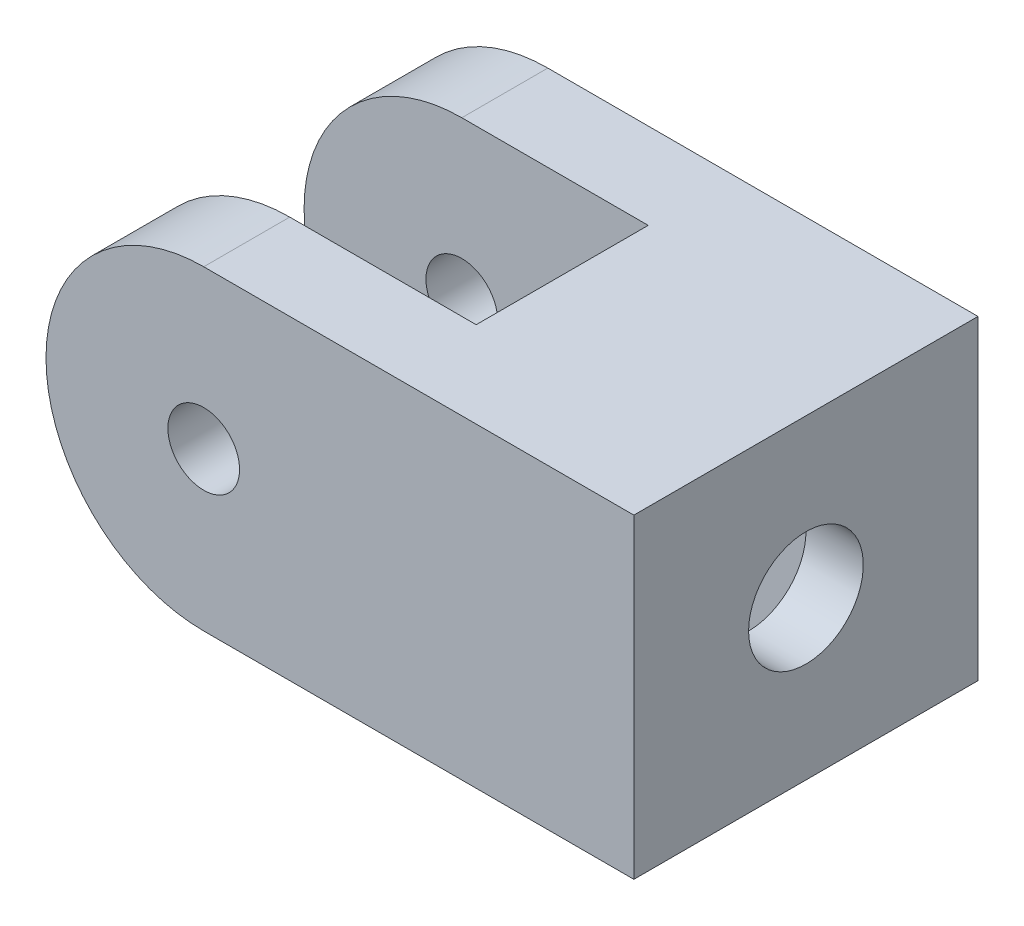
ISO-10303-21;
HEADER;
FILE_DESCRIPTION(('STEP AP214'),'2;1');
FILE_NAME('part.step','',(''),(''),'','','');
FILE_SCHEMA(('AUTOMOTIVE_DESIGN { 1 0 10303 214 1 1 1 1 }'));
ENDSEC;
DATA;
#1=APPLICATION_CONTEXT('core data for automotive mechanical design processes');
#2=APPLICATION_PROTOCOL_DEFINITION('international standard','automotive_design',2000,#1);
#3=PRODUCT_CONTEXT('',#1,'mechanical');
#4=PRODUCT('Part','Part','',(#3));
#5=PRODUCT_RELATED_PRODUCT_CATEGORY('part','',(#4));
#6=PRODUCT_DEFINITION_FORMATION('','',#4);
#7=PRODUCT_DEFINITION_CONTEXT('part definition',#1,'design');
#8=PRODUCT_DEFINITION('design','',#6,#7);
#9=PRODUCT_DEFINITION_SHAPE('','',#8);
#10=(LENGTH_UNIT() NAMED_UNIT(*) SI_UNIT(.MILLI.,.METRE.));
#11=(NAMED_UNIT(*) PLANE_ANGLE_UNIT() SI_UNIT($,.RADIAN.));
#12=(NAMED_UNIT(*) SI_UNIT($,.STERADIAN.) SOLID_ANGLE_UNIT());
#13=UNCERTAINTY_MEASURE_WITH_UNIT(LENGTH_MEASURE(1.E-05),#10,'distance_accuracy_value','');
#14=(GEOMETRIC_REPRESENTATION_CONTEXT(3) GLOBAL_UNCERTAINTY_ASSIGNED_CONTEXT((#13)) GLOBAL_UNIT_ASSIGNED_CONTEXT((#10,
#11,#12)) REPRESENTATION_CONTEXT('',''));
#15=CARTESIAN_POINT('',(0.,0.,0.));
#16=DIRECTION('',(0.,0.,1.));
#17=DIRECTION('',(1.,0.,0.));
#18=AXIS2_PLACEMENT_3D('',#15,#16,#17);
#19=CARTESIAN_POINT('',(13.,-11.,-5.99999999999999));
#20=DIRECTION('',(1.,0.,0.));
#21=DIRECTION('',(0.,0.,-1.));
#22=AXIS2_PLACEMENT_3D('',#19,#20,#21);
#23=PLANE('',#22);
#24=DIRECTION('',(0.,0.,-1.));
#25=VECTOR('',#24,1.);
#26=CARTESIAN_POINT('',(13.,11.,-5.99999999999999));
#27=LINE('',#26,#25);
#28=CARTESIAN_POINT('',(13.,11.,-5.99999999999999));
#29=VERTEX_POINT('',#28);
#30=CARTESIAN_POINT('',(13.,11.,-18.));
#31=VERTEX_POINT('',#30);
#32=EDGE_CURVE('E186',#29,#31,#27,.T.);
#33=ORIENTED_EDGE('',*,*,#32,.T.);
#34=DIRECTION('',(0.,1.,0.));
#35=VECTOR('',#34,1.);
#36=CARTESIAN_POINT('',(13.,-11.,-18.));
#37=LINE('',#36,#35);
#38=CARTESIAN_POINT('',(13.,-11.,-18.));
#39=VERTEX_POINT('',#38);
#40=EDGE_CURVE('E196',#39,#31,#37,.T.);
#41=ORIENTED_EDGE('',*,*,#40,.F.);
#42=DIRECTION('',(0.,0.,-1.));
#43=VECTOR('',#42,1.);
#44=CARTESIAN_POINT('',(13.,-11.,-5.99999999999999));
#45=LINE('',#44,#43);
#46=CARTESIAN_POINT('',(13.,-11.,-5.99999999999999));
#47=VERTEX_POINT('',#46);
#48=EDGE_CURVE('E189',#47,#39,#45,.T.);
#49=ORIENTED_EDGE('',*,*,#48,.F.);
#50=DIRECTION('',(0.,1.,0.));
#51=VECTOR('',#50,1.);
#52=CARTESIAN_POINT('',(13.,-11.,-5.99999999999999));
#53=LINE('',#52,#51);
#54=EDGE_CURVE('E192',#47,#29,#53,.T.);
#55=ORIENTED_EDGE('',*,*,#54,.T.);
#56=EDGE_LOOP('',(#33,#41,#49,#55));
#57=FACE_BOUND('',#56,.T.);
#58=CARTESIAN_POINT('',(13.,0.,-12.));
#59=DIRECTION('',(-1.,0.,0.));
#60=DIRECTION('',(0.,0.,1.));
#61=AXIS2_PLACEMENT_3D('',#58,#59,#60);
#62=CIRCLE('',#61,4.);
#63=CARTESIAN_POINT('',(13.,0.,-8.));
#64=VERTEX_POINT('',#63);
#65=EDGE_CURVE('E317',#64,#64,#62,.T.);
#66=ORIENTED_EDGE('',*,*,#65,.F.);
#67=EDGE_LOOP('',(#66));
#68=FACE_BOUND('',#67,.T.);
#69=ADVANCED_FACE('F36',(#57,#68),#23,.F.);
#70=CARTESIAN_POINT('',(30.,-11.,0.));
#71=DIRECTION('',(0.,-1.,0.));
#72=DIRECTION('',(0.,0.,-1.));
#73=AXIS2_PLACEMENT_3D('',#70,#71,#72);
#74=PLANE('',#73);
#75=DIRECTION('',(-1.,0.,0.));
#76=VECTOR('',#75,1.);
#77=CARTESIAN_POINT('',(13.,-11.,-18.));
#78=LINE('',#77,#76);
#79=CARTESIAN_POINT('',(0.,-11.,-18.));
#80=VERTEX_POINT('',#79);
#81=EDGE_CURVE('E182',#39,#80,#78,.T.);
#82=ORIENTED_EDGE('',*,*,#81,.T.);
#83=DIRECTION('',(0.,0.,-1.));
#84=VECTOR('',#83,1.);
#85=CARTESIAN_POINT('',(0.,-11.,0.));
#86=LINE('',#85,#84);
#87=CARTESIAN_POINT('',(0.,-11.,-24.));
#88=VERTEX_POINT('',#87);
#89=EDGE_CURVE('E230',#80,#88,#86,.T.);
#90=ORIENTED_EDGE('',*,*,#89,.T.);
#91=DIRECTION('',(-1.,0.,0.));
#92=VECTOR('',#91,1.);
#93=CARTESIAN_POINT('',(30.,-11.,-24.));
#94=LINE('',#93,#92);
#95=CARTESIAN_POINT('',(30.,-11.,-24.));
#96=VERTEX_POINT('',#95);
#97=EDGE_CURVE('E208',#96,#88,#94,.T.);
#98=ORIENTED_EDGE('',*,*,#97,.F.);
#99=DIRECTION('',(0.,0.,-1.));
#100=VECTOR('',#99,1.);
#101=CARTESIAN_POINT('',(30.,-11.,0.));
#102=LINE('',#101,#100);
#103=CARTESIAN_POINT('',(30.,-11.,0.));
#104=VERTEX_POINT('',#103);
#105=EDGE_CURVE('E231',#104,#96,#102,.T.);
#106=ORIENTED_EDGE('',*,*,#105,.F.);
#107=DIRECTION('',(-1.,0.,0.));
#108=VECTOR('',#107,1.);
#109=CARTESIAN_POINT('',(30.,-11.,0.));
#110=LINE('',#109,#108);
#111=CARTESIAN_POINT('',(0.,-11.,0.));
#112=VERTEX_POINT('',#111);
#113=EDGE_CURVE('E214',#104,#112,#110,.T.);
#114=ORIENTED_EDGE('',*,*,#113,.T.);
#115=CARTESIAN_POINT('',(0.,-11.,-5.99999999999999));
#116=VERTEX_POINT('',#115);
#117=EDGE_CURVE('E44',#112,#116,#86,.T.);
#118=ORIENTED_EDGE('',*,*,#117,.T.);
#119=DIRECTION('',(1.,0.,0.));
#120=VECTOR('',#119,1.);
#121=CARTESIAN_POINT('',(-17.11080660068,-11.,-5.99999999999999));
#122=LINE('',#121,#120);
#123=EDGE_CURVE('E185',#116,#47,#122,.T.);
#124=ORIENTED_EDGE('',*,*,#123,.T.);
#125=ORIENTED_EDGE('',*,*,#48,.T.);
#126=EDGE_LOOP('',(#82,#90,#98,#106,#114,#118,#124,#125));
#127=FACE_BOUND('',#126,.T.);
#128=DIRECTION('',(-1.,0.,0.));
#129=VECTOR('',#128,1.);
#130=CARTESIAN_POINT('',(26.,-11.,-5.5));
#131=LINE('',#130,#129);
#132=CARTESIAN_POINT('',(26.,-11.,-5.5));
#133=VERTEX_POINT('',#132);
#134=CARTESIAN_POINT('',(19.2,-11.,-5.5));
#135=VERTEX_POINT('',#134);
#136=EDGE_CURVE('E142',#133,#135,#131,.T.);
#137=ORIENTED_EDGE('',*,*,#136,.F.);
#138=DIRECTION('',(0.,0.,1.));
#139=VECTOR('',#138,1.);
#140=CARTESIAN_POINT('',(26.,-11.,-18.5));
#141=LINE('',#140,#139);
#142=CARTESIAN_POINT('',(26.,-11.,-18.5));
#143=VERTEX_POINT('',#142);
#144=EDGE_CURVE('E149',#143,#133,#141,.T.);
#145=ORIENTED_EDGE('',*,*,#144,.F.);
#146=DIRECTION('',(-1.,0.,0.));
#147=VECTOR('',#146,1.);
#148=CARTESIAN_POINT('',(26.,-11.,-18.5));
#149=LINE('',#148,#147);
#150=CARTESIAN_POINT('',(19.2,-11.,-18.5));
#151=VERTEX_POINT('',#150);
#152=EDGE_CURVE('E132',#143,#151,#149,.T.);
#153=ORIENTED_EDGE('',*,*,#152,.T.);
#154=DIRECTION('',(0.,0.,1.));
#155=VECTOR('',#154,1.);
#156=CARTESIAN_POINT('',(19.2,-11.,-18.5));
#157=LINE('',#156,#155);
#158=EDGE_CURVE('E165',#151,#135,#157,.T.);
#159=ORIENTED_EDGE('',*,*,#158,.T.);
#160=EDGE_LOOP('',(#137,#145,#153,#159));
#161=FACE_BOUND('',#160,.T.);
#162=ADVANCED_FACE('F155',(#127,#161),#74,.T.);
#163=CARTESIAN_POINT('',(0.,0.,0.));
#164=DIRECTION('',(0.,0.,-1.));
#165=DIRECTION('',(-1.,0.,0.));
#166=AXIS2_PLACEMENT_3D('',#163,#164,#165);
#167=CYLINDRICAL_SURFACE('',#166,11.);
#168=CARTESIAN_POINT('',(0.,0.,-18.));
#169=DIRECTION('',(0.,0.,-1.));
#170=DIRECTION('',(-1.,0.,0.));
#171=AXIS2_PLACEMENT_3D('',#168,#169,#170);
#172=CIRCLE('',#171,11.);
#173=CARTESIAN_POINT('',(0.,11.,-18.));
#174=VERTEX_POINT('',#173);
#175=EDGE_CURVE('E201',#174,#80,#172,.F.);
#176=ORIENTED_EDGE('',*,*,#175,.F.);
#177=DIRECTION('',(0.,0.,-1.));
#178=VECTOR('',#177,1.);
#179=CARTESIAN_POINT('',(0.,11.,0.));
#180=LINE('',#179,#178);
#181=CARTESIAN_POINT('',(0.,11.,-24.));
#182=VERTEX_POINT('',#181);
#183=EDGE_CURVE('E217',#174,#182,#180,.T.);
#184=ORIENTED_EDGE('',*,*,#183,.T.);
#185=CARTESIAN_POINT('',(0.,0.,-24.));
#186=DIRECTION('',(0.,0.,-1.));
#187=DIRECTION('',(-1.,0.,0.));
#188=AXIS2_PLACEMENT_3D('',#185,#186,#187);
#189=CIRCLE('',#188,11.);
#190=EDGE_CURVE('E203',#88,#182,#189,.T.);
#191=ORIENTED_EDGE('',*,*,#190,.F.);
#192=ORIENTED_EDGE('',*,*,#89,.F.);
#193=EDGE_LOOP('',(#176,#184,#191,#192));
#194=FACE_BOUND('',#193,.T.);
#195=ADVANCED_FACE('F242',(#194),#167,.T.);
#196=CARTESIAN_POINT('',(0.,0.,-5.99999999999999));
#197=DIRECTION('',(0.,0.,1.));
#198=DIRECTION('',(1.,0.,0.));
#199=AXIS2_PLACEMENT_3D('',#196,#197,#198);
#200=CIRCLE('',#199,11.);
#201=CARTESIAN_POINT('',(0.,11.,-5.99999999999999));
#202=VERTEX_POINT('',#201);
#203=EDGE_CURVE('E58',#116,#202,#200,.F.);
#204=ORIENTED_EDGE('',*,*,#203,.F.);
#205=ORIENTED_EDGE('',*,*,#117,.F.);
#206=CARTESIAN_POINT('',(0.,0.,0.));
#207=DIRECTION('',(0.,0.,-1.));
#208=DIRECTION('',(-1.,0.,0.));
#209=AXIS2_PLACEMENT_3D('',#206,#207,#208);
#210=CIRCLE('',#209,11.);
#211=CARTESIAN_POINT('',(0.,11.,0.));
#212=VERTEX_POINT('',#211);
#213=EDGE_CURVE('E204',#112,#212,#210,.T.);
#214=ORIENTED_EDGE('',*,*,#213,.T.);
#215=EDGE_CURVE('E234',#212,#202,#180,.T.);
#216=ORIENTED_EDGE('',*,*,#215,.T.);
#217=EDGE_LOOP('',(#204,#205,#214,#216));
#218=FACE_BOUND('',#217,.T.);
#219=ADVANCED_FACE('F38',(#218),#167,.T.);
#220=CARTESIAN_POINT('',(30.,11.,0.));
#221=DIRECTION('',(1.,0.,0.));
#222=DIRECTION('',(0.,0.,-1.));
#223=AXIS2_PLACEMENT_3D('',#220,#221,#222);
#224=PLANE('',#223);
#225=CARTESIAN_POINT('',(30.,0.,-12.));
#226=DIRECTION('',(-1.,0.,0.));
#227=DIRECTION('',(0.,0.,1.));
#228=AXIS2_PLACEMENT_3D('',#225,#226,#227);
#229=CIRCLE('',#228,4.);
#230=CARTESIAN_POINT('',(30.,0.,-8.));
#231=VERTEX_POINT('',#230);
#232=EDGE_CURVE('E315',#231,#231,#229,.T.);
#233=ORIENTED_EDGE('',*,*,#232,.T.);
#234=EDGE_LOOP('',(#233));
#235=FACE_BOUND('',#234,.T.);
#236=DIRECTION('',(0.,-1.,0.));
#237=VECTOR('',#236,1.);
#238=CARTESIAN_POINT('',(30.,11.,-24.));
#239=LINE('',#238,#237);
#240=CARTESIAN_POINT('',(30.,11.,-24.));
#241=VERTEX_POINT('',#240);
#242=EDGE_CURVE('E223',#241,#96,#239,.T.);
#243=ORIENTED_EDGE('',*,*,#242,.F.);
#244=DIRECTION('',(0.,0.,-1.));
#245=VECTOR('',#244,1.);
#246=CARTESIAN_POINT('',(30.,11.,0.));
#247=LINE('',#246,#245);
#248=CARTESIAN_POINT('',(30.,11.,0.));
#249=VERTEX_POINT('',#248);
#250=EDGE_CURVE('E233',#249,#241,#247,.T.);
#251=ORIENTED_EDGE('',*,*,#250,.F.);
#252=DIRECTION('',(0.,-1.,0.));
#253=VECTOR('',#252,1.);
#254=CARTESIAN_POINT('',(30.,11.,0.));
#255=LINE('',#254,#253);
#256=EDGE_CURVE('E211',#249,#104,#255,.T.);
#257=ORIENTED_EDGE('',*,*,#256,.T.);
#258=ORIENTED_EDGE('',*,*,#105,.T.);
#259=EDGE_LOOP('',(#243,#251,#257,#258));
#260=FACE_BOUND('',#259,.T.);
#261=ADVANCED_FACE('F267',(#235,#260),#224,.T.);
#262=CARTESIAN_POINT('',(0.,11.,0.));
#263=DIRECTION('',(0.,1.,0.));
#264=DIRECTION('',(0.,0.,1.));
#265=AXIS2_PLACEMENT_3D('',#262,#263,#264);
#266=PLANE('',#265);
#267=DIRECTION('',(-1.,0.,0.));
#268=VECTOR('',#267,1.);
#269=CARTESIAN_POINT('',(13.,11.,-18.));
#270=LINE('',#269,#268);
#271=EDGE_CURVE('E176',#31,#174,#270,.T.);
#272=ORIENTED_EDGE('',*,*,#271,.F.);
#273=ORIENTED_EDGE('',*,*,#32,.F.);
#274=DIRECTION('',(1.,0.,0.));
#275=VECTOR('',#274,1.);
#276=CARTESIAN_POINT('',(0.,11.,-5.99999999999999));
#277=LINE('',#276,#275);
#278=EDGE_CURVE('E11',#202,#29,#277,.T.);
#279=ORIENTED_EDGE('',*,*,#278,.F.);
#280=ORIENTED_EDGE('',*,*,#215,.F.);
#281=DIRECTION('',(1.,0.,0.));
#282=VECTOR('',#281,1.);
#283=CARTESIAN_POINT('',(0.,11.,0.));
#284=LINE('',#283,#282);
#285=EDGE_CURVE('E207',#212,#249,#284,.T.);
#286=ORIENTED_EDGE('',*,*,#285,.T.);
#287=ORIENTED_EDGE('',*,*,#250,.T.);
#288=DIRECTION('',(1.,0.,0.));
#289=VECTOR('',#288,1.);
#290=CARTESIAN_POINT('',(0.,11.,-24.));
#291=LINE('',#290,#289);
#292=EDGE_CURVE('E220',#182,#241,#291,.T.);
#293=ORIENTED_EDGE('',*,*,#292,.F.);
#294=ORIENTED_EDGE('',*,*,#183,.F.);
#295=EDGE_LOOP('',(#272,#273,#279,#280,#286,#287,#293,#294));
#296=FACE_BOUND('',#295,.T.);
#297=ADVANCED_FACE('F246',(#296),#266,.T.);
#298=CARTESIAN_POINT('',(0.,0.,0.));
#299=DIRECTION('',(0.,0.,-1.));
#300=DIRECTION('',(-1.,0.,0.));
#301=AXIS2_PLACEMENT_3D('',#298,#299,#300);
#302=PLANE('',#301);
#303=CARTESIAN_POINT('',(0.,0.,0.));
#304=DIRECTION('',(0.,0.,-1.));
#305=DIRECTION('',(-1.,0.,0.));
#306=AXIS2_PLACEMENT_3D('',#303,#304,#305);
#307=CIRCLE('',#306,2.5);
#308=CARTESIAN_POINT('',(-2.5,0.,0.));
#309=VERTEX_POINT('',#308);
#310=EDGE_CURVE('E303',#309,#309,#307,.T.);
#311=ORIENTED_EDGE('',*,*,#310,.T.);
#312=EDGE_LOOP('',(#311));
#313=FACE_BOUND('',#312,.T.);
#314=ORIENTED_EDGE('',*,*,#213,.F.);
#315=ORIENTED_EDGE('',*,*,#113,.F.);
#316=ORIENTED_EDGE('',*,*,#256,.F.);
#317=ORIENTED_EDGE('',*,*,#285,.F.);
#318=EDGE_LOOP('',(#314,#315,#316,#317));
#319=FACE_BOUND('',#318,.T.);
#320=ADVANCED_FACE('F264',(#313,#319),#302,.F.);
#321=CARTESIAN_POINT('',(0.,0.,-24.));
#322=DIRECTION('',(0.,0.,-1.));
#323=DIRECTION('',(-1.,0.,0.));
#324=AXIS2_PLACEMENT_3D('',#321,#322,#323);
#325=PLANE('',#324);
#326=CARTESIAN_POINT('',(0.,0.,-24.));
#327=DIRECTION('',(0.,0.,-1.));
#328=DIRECTION('',(-1.,0.,0.));
#329=AXIS2_PLACEMENT_3D('',#326,#327,#328);
#330=CIRCLE('',#329,2.5);
#331=CARTESIAN_POINT('',(-2.5,0.,-24.));
#332=VERTEX_POINT('',#331);
#333=EDGE_CURVE('E300',#332,#332,#330,.T.);
#334=ORIENTED_EDGE('',*,*,#333,.F.);
#335=EDGE_LOOP('',(#334));
#336=FACE_BOUND('',#335,.T.);
#337=ORIENTED_EDGE('',*,*,#190,.T.);
#338=ORIENTED_EDGE('',*,*,#292,.T.);
#339=ORIENTED_EDGE('',*,*,#242,.T.);
#340=ORIENTED_EDGE('',*,*,#97,.T.);
#341=EDGE_LOOP('',(#337,#338,#339,#340));
#342=FACE_BOUND('',#341,.T.);
#343=ADVANCED_FACE('F249',(#336,#342),#325,.T.);
#344=CARTESIAN_POINT('',(13.,-11.,-18.));
#345=DIRECTION('',(0.,0.,-1.));
#346=DIRECTION('',(-1.,0.,0.));
#347=AXIS2_PLACEMENT_3D('',#344,#345,#346);
#348=PLANE('',#347);
#349=CARTESIAN_POINT('',(0.,0.,-18.));
#350=DIRECTION('',(0.,0.,-1.));
#351=DIRECTION('',(-1.,0.,0.));
#352=AXIS2_PLACEMENT_3D('',#349,#350,#351);
#353=CIRCLE('',#352,2.5);
#354=CARTESIAN_POINT('',(-2.5,0.,-18.));
#355=VERTEX_POINT('',#354);
#356=EDGE_CURVE('E302',#355,#355,#353,.T.);
#357=ORIENTED_EDGE('',*,*,#356,.T.);
#358=EDGE_LOOP('',(#357));
#359=FACE_BOUND('',#358,.T.);
#360=ORIENTED_EDGE('',*,*,#175,.T.);
#361=ORIENTED_EDGE('',*,*,#81,.F.);
#362=ORIENTED_EDGE('',*,*,#40,.T.);
#363=ORIENTED_EDGE('',*,*,#271,.T.);
#364=EDGE_LOOP('',(#360,#361,#362,#363));
#365=FACE_BOUND('',#364,.T.);
#366=ADVANCED_FACE('F255',(#359,#365),#348,.F.);
#367=CARTESIAN_POINT('',(-17.11080660068,-11.,-5.99999999999999));
#368=DIRECTION('',(0.,0.,1.));
#369=DIRECTION('',(1.,0.,0.));
#370=AXIS2_PLACEMENT_3D('',#367,#368,#369);
#371=PLANE('',#370);
#372=CARTESIAN_POINT('',(0.,0.,-5.99999999999999));
#373=DIRECTION('',(0.,0.,-1.));
#374=DIRECTION('',(-1.,0.,0.));
#375=AXIS2_PLACEMENT_3D('',#372,#373,#374);
#376=CIRCLE('',#375,2.5);
#377=CARTESIAN_POINT('',(-2.5,0.,-5.99999999999999));
#378=VERTEX_POINT('',#377);
#379=EDGE_CURVE('E309',#378,#378,#376,.T.);
#380=ORIENTED_EDGE('',*,*,#379,.F.);
#381=EDGE_LOOP('',(#380));
#382=FACE_BOUND('',#381,.T.);
#383=ORIENTED_EDGE('',*,*,#203,.T.);
#384=ORIENTED_EDGE('',*,*,#278,.T.);
#385=ORIENTED_EDGE('',*,*,#54,.F.);
#386=ORIENTED_EDGE('',*,*,#123,.F.);
#387=EDGE_LOOP('',(#383,#384,#385,#386));
#388=FACE_BOUND('',#387,.T.);
#389=ADVANCED_FACE('F259',(#382,#388),#371,.F.);
#390=CARTESIAN_POINT('',(26.,3.75277674973258,-18.5));
#391=DIRECTION('',(0.,0.,-1.));
#392=DIRECTION('',(-1.,0.,0.));
#393=AXIS2_PLACEMENT_3D('',#390,#391,#392);
#394=PLANE('',#393);
#395=DIRECTION('',(0.,-1.,0.));
#396=VECTOR('',#395,1.);
#397=CARTESIAN_POINT('',(19.2,3.75277674973258,-18.5));
#398=LINE('',#397,#396);
#399=CARTESIAN_POINT('',(19.2,3.75277674973258,-18.5));
#400=VERTEX_POINT('',#399);
#401=EDGE_CURVE('E138',#400,#151,#398,.T.);
#402=ORIENTED_EDGE('',*,*,#401,.T.);
#403=ORIENTED_EDGE('',*,*,#152,.F.);
#404=DIRECTION('',(0.,-1.,0.));
#405=VECTOR('',#404,1.);
#406=CARTESIAN_POINT('',(26.,3.75277674973258,-18.5));
#407=LINE('',#406,#405);
#408=CARTESIAN_POINT('',(26.,3.75277674973258,-18.5));
#409=VERTEX_POINT('',#408);
#410=EDGE_CURVE('E135',#409,#143,#407,.T.);
#411=ORIENTED_EDGE('',*,*,#410,.F.);
#412=DIRECTION('',(-1.,0.,0.));
#413=VECTOR('',#412,1.);
#414=CARTESIAN_POINT('',(26.,3.75277674973258,-18.5));
#415=LINE('',#414,#413);
#416=EDGE_CURVE('E174',#409,#400,#415,.T.);
#417=ORIENTED_EDGE('',*,*,#416,.T.);
#418=EDGE_LOOP('',(#402,#403,#411,#417));
#419=FACE_BOUND('',#418,.T.);
#420=ADVANCED_FACE('F134',(#419),#394,.F.);
#421=CARTESIAN_POINT('',(26.,7.50555349946514,-12.));
#422=DIRECTION('',(0.,0.866025403784439,-0.5));
#423=DIRECTION('',(0.,0.5,0.866025403784439));
#424=AXIS2_PLACEMENT_3D('',#421,#422,#423);
#425=PLANE('',#424);
#426=DIRECTION('',(0.,-0.5,-0.866025403784439));
#427=VECTOR('',#426,1.);
#428=CARTESIAN_POINT('',(19.2,7.50555349946514,-12.));
#429=LINE('',#428,#427);
#430=CARTESIAN_POINT('',(19.2,7.50555349946514,-12.));
#431=VERTEX_POINT('',#430);
#432=EDGE_CURVE('E153',#431,#400,#429,.T.);
#433=ORIENTED_EDGE('',*,*,#432,.T.);
#434=ORIENTED_EDGE('',*,*,#416,.F.);
#435=DIRECTION('',(0.,-0.5,-0.866025403784439));
#436=VECTOR('',#435,1.);
#437=CARTESIAN_POINT('',(26.,7.50555349946514,-12.));
#438=LINE('',#437,#436);
#439=CARTESIAN_POINT('',(26.,7.50555349946514,-12.));
#440=VERTEX_POINT('',#439);
#441=EDGE_CURVE('E143',#440,#409,#438,.T.);
#442=ORIENTED_EDGE('',*,*,#441,.F.);
#443=DIRECTION('',(-1.,0.,0.));
#444=VECTOR('',#443,1.);
#445=CARTESIAN_POINT('',(26.,7.50555349946514,-12.));
#446=LINE('',#445,#444);
#447=EDGE_CURVE('E177',#440,#431,#446,.T.);
#448=ORIENTED_EDGE('',*,*,#447,.T.);
#449=EDGE_LOOP('',(#433,#434,#442,#448));
#450=FACE_BOUND('',#449,.T.);
#451=ADVANCED_FACE('F344',(#450),#425,.F.);
#452=CARTESIAN_POINT('',(26.,3.75277674973257,-5.5));
#453=DIRECTION('',(0.,0.866025403784439,0.5));
#454=DIRECTION('',(0.,-0.5,0.866025403784438));
#455=AXIS2_PLACEMENT_3D('',#452,#453,#454);
#456=PLANE('',#455);
#457=DIRECTION('',(0.,0.5,-0.866025403784439));
#458=VECTOR('',#457,1.);
#459=CARTESIAN_POINT('',(19.2,3.75277674973257,-5.5));
#460=LINE('',#459,#458);
#461=CARTESIAN_POINT('',(19.2,3.75277674973257,-5.5));
#462=VERTEX_POINT('',#461);
#463=EDGE_CURVE('E169',#462,#431,#460,.T.);
#464=ORIENTED_EDGE('',*,*,#463,.T.);
#465=ORIENTED_EDGE('',*,*,#447,.F.);
#466=DIRECTION('',(0.,0.5,-0.866025403784439));
#467=VECTOR('',#466,1.);
#468=CARTESIAN_POINT('',(26.,3.75277674973257,-5.5));
#469=LINE('',#468,#467);
#470=CARTESIAN_POINT('',(26.,3.75277674973257,-5.5));
#471=VERTEX_POINT('',#470);
#472=EDGE_CURVE('E158',#471,#440,#469,.T.);
#473=ORIENTED_EDGE('',*,*,#472,.F.);
#474=DIRECTION('',(-1.,0.,0.));
#475=VECTOR('',#474,1.);
#476=CARTESIAN_POINT('',(26.,3.75277674973257,-5.5));
#477=LINE('',#476,#475);
#478=EDGE_CURVE('E179',#471,#462,#477,.T.);
#479=ORIENTED_EDGE('',*,*,#478,.T.);
#480=EDGE_LOOP('',(#464,#465,#473,#479));
#481=FACE_BOUND('',#480,.T.);
#482=ADVANCED_FACE('F347',(#481),#456,.F.);
#483=CARTESIAN_POINT('',(26.,-11.,-5.5));
#484=DIRECTION('',(0.,0.,1.));
#485=DIRECTION('',(1.,0.,0.));
#486=AXIS2_PLACEMENT_3D('',#483,#484,#485);
#487=PLANE('',#486);
#488=DIRECTION('',(0.,1.,0.));
#489=VECTOR('',#488,1.);
#490=CARTESIAN_POINT('',(19.2,-11.,-5.5));
#491=LINE('',#490,#489);
#492=EDGE_CURVE('E51',#135,#462,#491,.T.);
#493=ORIENTED_EDGE('',*,*,#492,.T.);
#494=ORIENTED_EDGE('',*,*,#478,.F.);
#495=DIRECTION('',(0.,1.,0.));
#496=VECTOR('',#495,1.);
#497=CARTESIAN_POINT('',(26.,-11.,-5.5));
#498=LINE('',#497,#496);
#499=EDGE_CURVE('E156',#133,#471,#498,.T.);
#500=ORIENTED_EDGE('',*,*,#499,.F.);
#501=ORIENTED_EDGE('',*,*,#136,.T.);
#502=EDGE_LOOP('',(#493,#494,#500,#501));
#503=FACE_BOUND('',#502,.T.);
#504=ADVANCED_FACE('F341',(#503),#487,.F.);
#505=CARTESIAN_POINT('',(26.,0.,0.));
#506=DIRECTION('',(-1.,0.,0.));
#507=DIRECTION('',(0.,0.,1.));
#508=AXIS2_PLACEMENT_3D('',#505,#506,#507);
#509=PLANE('',#508);
#510=CARTESIAN_POINT('',(26.,0.,-12.));
#511=DIRECTION('',(-1.,0.,0.));
#512=DIRECTION('',(0.,0.,1.));
#513=AXIS2_PLACEMENT_3D('',#510,#511,#512);
#514=CIRCLE('',#513,4.);
#515=CARTESIAN_POINT('',(26.,0.,-8.));
#516=VERTEX_POINT('',#515);
#517=EDGE_CURVE('E306',#516,#516,#514,.T.);
#518=ORIENTED_EDGE('',*,*,#517,.F.);
#519=EDGE_LOOP('',(#518));
#520=FACE_BOUND('',#519,.T.);
#521=ORIENTED_EDGE('',*,*,#410,.T.);
#522=ORIENTED_EDGE('',*,*,#144,.T.);
#523=ORIENTED_EDGE('',*,*,#499,.T.);
#524=ORIENTED_EDGE('',*,*,#472,.T.);
#525=ORIENTED_EDGE('',*,*,#441,.T.);
#526=EDGE_LOOP('',(#521,#522,#523,#524,#525));
#527=FACE_BOUND('',#526,.T.);
#528=ADVANCED_FACE('F147',(#520,#527),#509,.T.);
#529=CARTESIAN_POINT('',(19.2,0.,0.));
#530=DIRECTION('',(-1.,0.,0.));
#531=DIRECTION('',(0.,0.,1.));
#532=AXIS2_PLACEMENT_3D('',#529,#530,#531);
#533=PLANE('',#532);
#534=CARTESIAN_POINT('',(19.2,0.,-12.));
#535=DIRECTION('',(-1.,0.,0.));
#536=DIRECTION('',(0.,0.,1.));
#537=AXIS2_PLACEMENT_3D('',#534,#535,#536);
#538=CIRCLE('',#537,4.);
#539=CARTESIAN_POINT('',(19.2,0.,-8.));
#540=VERTEX_POINT('',#539);
#541=EDGE_CURVE('E166',#540,#540,#538,.T.);
#542=ORIENTED_EDGE('',*,*,#541,.T.);
#543=EDGE_LOOP('',(#542));
#544=FACE_BOUND('',#543,.T.);
#545=ORIENTED_EDGE('',*,*,#401,.F.);
#546=ORIENTED_EDGE('',*,*,#432,.F.);
#547=ORIENTED_EDGE('',*,*,#463,.F.);
#548=ORIENTED_EDGE('',*,*,#492,.F.);
#549=ORIENTED_EDGE('',*,*,#158,.F.);
#550=EDGE_LOOP('',(#545,#546,#547,#548,#549));
#551=FACE_BOUND('',#550,.T.);
#552=ADVANCED_FACE('F322',(#544,#551),#533,.F.);
#553=CARTESIAN_POINT('',(13.,0.,-12.));
#554=DIRECTION('',(-1.,0.,0.));
#555=DIRECTION('',(0.,0.,1.));
#556=AXIS2_PLACEMENT_3D('',#553,#554,#555);
#557=CYLINDRICAL_SURFACE('',#556,4.);
#558=ORIENTED_EDGE('',*,*,#541,.F.);
#559=EDGE_LOOP('',(#558));
#560=FACE_BOUND('',#559,.T.);
#561=ORIENTED_EDGE('',*,*,#65,.T.);
#562=EDGE_LOOP('',(#561));
#563=FACE_BOUND('',#562,.T.);
#564=ADVANCED_FACE('F324',(#560,#563),#557,.F.);
#565=CARTESIAN_POINT('',(26.,0.,-12.));
#566=DIRECTION('',(-1.,0.,0.));
#567=DIRECTION('',(0.,0.,1.));
#568=AXIS2_PLACEMENT_3D('',#565,#566,#567);
#569=CYLINDRICAL_SURFACE('',#568,4.);
#570=ORIENTED_EDGE('',*,*,#232,.F.);
#571=EDGE_LOOP('',(#570));
#572=FACE_BOUND('',#571,.T.);
#573=ORIENTED_EDGE('',*,*,#517,.T.);
#574=EDGE_LOOP('',(#573));
#575=FACE_BOUND('',#574,.T.);
#576=ADVANCED_FACE('F327',(#572,#575),#569,.F.);
#577=CARTESIAN_POINT('',(0.,0.,-24.));
#578=DIRECTION('',(0.,0.,-1.));
#579=DIRECTION('',(-1.,0.,0.));
#580=AXIS2_PLACEMENT_3D('',#577,#578,#579);
#581=CYLINDRICAL_SURFACE('',#580,2.5);
#582=ORIENTED_EDGE('',*,*,#356,.F.);
#583=EDGE_LOOP('',(#582));
#584=FACE_BOUND('',#583,.T.);
#585=ORIENTED_EDGE('',*,*,#333,.T.);
#586=EDGE_LOOP('',(#585));
#587=FACE_BOUND('',#586,.T.);
#588=ADVANCED_FACE('F334',(#584,#587),#581,.F.);
#589=CARTESIAN_POINT('',(0.,0.,-5.99999999999999));
#590=DIRECTION('',(0.,0.,-1.));
#591=DIRECTION('',(-1.,0.,0.));
#592=AXIS2_PLACEMENT_3D('',#589,#590,#591);
#593=CYLINDRICAL_SURFACE('',#592,2.5);
#594=ORIENTED_EDGE('',*,*,#310,.F.);
#595=EDGE_LOOP('',(#594));
#596=FACE_BOUND('',#595,.T.);
#597=ORIENTED_EDGE('',*,*,#379,.T.);
#598=EDGE_LOOP('',(#597));
#599=FACE_BOUND('',#598,.T.);
#600=ADVANCED_FACE('F451',(#596,#599),#593,.F.);
#601=CLOSED_SHELL('',(#69,#162,#195,#219,#261,#297,#320,#343,#366,#389,#420,#451,#482,#504,#528,
#552,#564,#576,#588,#600));
#602=MANIFOLD_SOLID_BREP('B2',#601);
#603=ADVANCED_BREP_SHAPE_REPRESENTATION('',(#18,#602),#14);
#604=SHAPE_DEFINITION_REPRESENTATION(#9,#603);
ENDSEC;
END-ISO-10303-21;
